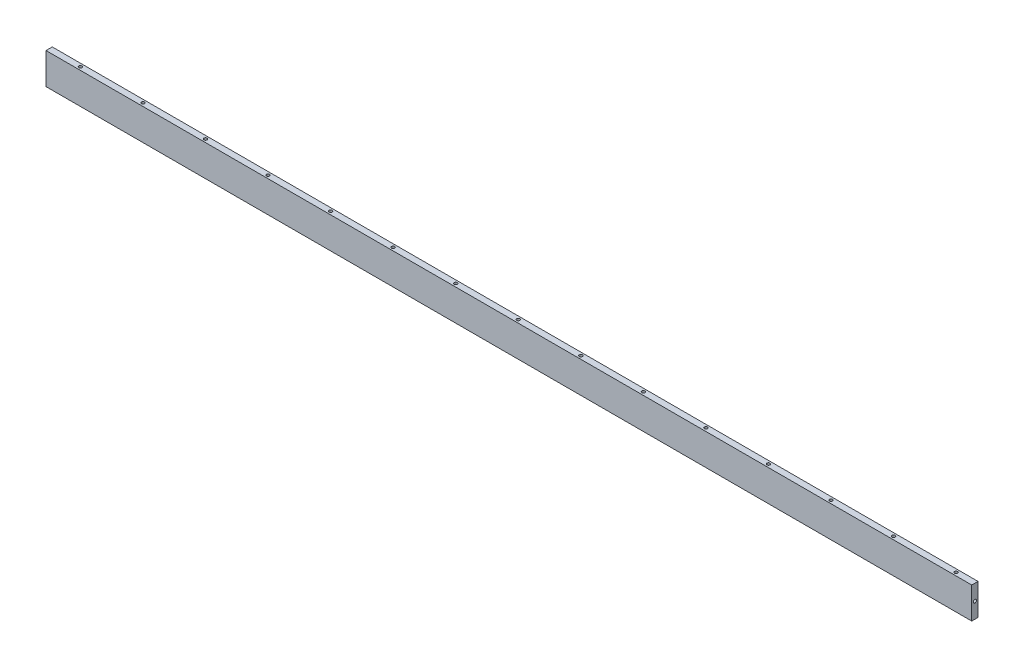
ISO-10303-21;
HEADER;
FILE_DESCRIPTION(('STEP AP214'),'2;1');
FILE_NAME('part.step','',(''),(''),'','','');
FILE_SCHEMA(('AUTOMOTIVE_DESIGN { 1 0 10303 214 1 1 1 1 }'));
ENDSEC;
DATA;
#1=APPLICATION_CONTEXT('core data for automotive mechanical design processes');
#2=APPLICATION_PROTOCOL_DEFINITION('international standard','automotive_design',2000,#1);
#3=PRODUCT_CONTEXT('',#1,'mechanical');
#4=PRODUCT('Part','Part','',(#3));
#5=PRODUCT_RELATED_PRODUCT_CATEGORY('part','',(#4));
#6=PRODUCT_DEFINITION_FORMATION('','',#4);
#7=PRODUCT_DEFINITION_CONTEXT('part definition',#1,'design');
#8=PRODUCT_DEFINITION('design','',#6,#7);
#9=PRODUCT_DEFINITION_SHAPE('','',#8);
#10=(LENGTH_UNIT() NAMED_UNIT(*) SI_UNIT(.MILLI.,.METRE.));
#11=(NAMED_UNIT(*) PLANE_ANGLE_UNIT() SI_UNIT($,.RADIAN.));
#12=(NAMED_UNIT(*) SI_UNIT($,.STERADIAN.) SOLID_ANGLE_UNIT());
#13=UNCERTAINTY_MEASURE_WITH_UNIT(LENGTH_MEASURE(1.E-05),#10,'distance_accuracy_value','');
#14=(GEOMETRIC_REPRESENTATION_CONTEXT(3) GLOBAL_UNCERTAINTY_ASSIGNED_CONTEXT((#13)) GLOBAL_UNIT_ASSIGNED_CONTEXT((#10,
#11,#12)) REPRESENTATION_CONTEXT('',''));
#15=CARTESIAN_POINT('',(0.,0.,0.));
#16=DIRECTION('',(0.,0.,1.));
#17=DIRECTION('',(1.,0.,0.));
#18=AXIS2_PLACEMENT_3D('',#15,#16,#17);
#19=CARTESIAN_POINT('',(-740.,-25.,5.));
#20=DIRECTION('',(1.,0.,0.));
#21=DIRECTION('',(0.,0.,-1.));
#22=AXIS2_PLACEMENT_3D('',#19,#20,#21);
#23=PLANE('',#22);
#24=DIRECTION('',(0.,-1.,0.));
#25=VECTOR('',#24,1.);
#26=CARTESIAN_POINT('',(-740.,-25.,-5.));
#27=LINE('',#26,#25);
#28=CARTESIAN_POINT('',(-740.,25.,-5.));
#29=VERTEX_POINT('',#28);
#30=CARTESIAN_POINT('',(-740.,-25.,-5.));
#31=VERTEX_POINT('',#30);
#32=EDGE_CURVE('E67',#29,#31,#27,.T.);
#33=ORIENTED_EDGE('',*,*,#32,.T.);
#34=DIRECTION('',(0.,0.,-1.));
#35=VECTOR('',#34,1.);
#36=CARTESIAN_POINT('',(-740.,-25.,5.));
#37=LINE('',#36,#35);
#38=CARTESIAN_POINT('',(-740.,-25.,5.));
#39=VERTEX_POINT('',#38);
#40=EDGE_CURVE('E90',#39,#31,#37,.T.);
#41=ORIENTED_EDGE('',*,*,#40,.F.);
#42=DIRECTION('',(0.,-1.,0.));
#43=VECTOR('',#42,1.);
#44=CARTESIAN_POINT('',(-740.,-25.,5.));
#45=LINE('',#44,#43);
#46=CARTESIAN_POINT('',(-740.,25.,5.));
#47=VERTEX_POINT('',#46);
#48=EDGE_CURVE('E83',#47,#39,#45,.T.);
#49=ORIENTED_EDGE('',*,*,#48,.F.);
#50=DIRECTION('',(0.,0.,-1.));
#51=VECTOR('',#50,1.);
#52=CARTESIAN_POINT('',(-740.,25.,5.));
#53=LINE('',#52,#51);
#54=EDGE_CURVE('E42',#47,#29,#53,.T.);
#55=ORIENTED_EDGE('',*,*,#54,.T.);
#56=EDGE_LOOP('',(#33,#41,#49,#55));
#57=FACE_BOUND('',#56,.T.);
#58=CARTESIAN_POINT('',(-740.,0.,0.));
#59=DIRECTION('',(1.,0.,0.));
#60=DIRECTION('',(0.,0.,-1.));
#61=AXIS2_PLACEMENT_3D('',#58,#59,#60);
#62=CIRCLE('',#61,2.5);
#63=CARTESIAN_POINT('',(-740.,0.,-2.5));
#64=VERTEX_POINT('',#63);
#65=EDGE_CURVE('E207',#64,#64,#62,.T.);
#66=ORIENTED_EDGE('',*,*,#65,.T.);
#67=EDGE_LOOP('',(#66));
#68=FACE_BOUND('',#67,.T.);
#69=ADVANCED_FACE('F33',(#57,#68),#23,.F.);
#70=CARTESIAN_POINT('',(740.,-25.,5.));
#71=DIRECTION('',(-1.,0.,0.));
#72=DIRECTION('',(0.,0.,1.));
#73=AXIS2_PLACEMENT_3D('',#70,#71,#72);
#74=PLANE('',#73);
#75=CARTESIAN_POINT('',(740.,0.,0.));
#76=DIRECTION('',(1.,0.,0.));
#77=DIRECTION('',(0.,0.,-1.));
#78=AXIS2_PLACEMENT_3D('',#75,#76,#77);
#79=CIRCLE('',#78,2.5);
#80=CARTESIAN_POINT('',(740.,0.,-2.5));
#81=VERTEX_POINT('',#80);
#82=EDGE_CURVE('E201',#81,#81,#79,.T.);
#83=ORIENTED_EDGE('',*,*,#82,.F.);
#84=EDGE_LOOP('',(#83));
#85=FACE_BOUND('',#84,.T.);
#86=DIRECTION('',(0.,1.,0.));
#87=VECTOR('',#86,1.);
#88=CARTESIAN_POINT('',(740.,-25.,-5.));
#89=LINE('',#88,#87);
#90=CARTESIAN_POINT('',(740.,-25.,-5.));
#91=VERTEX_POINT('',#90);
#92=CARTESIAN_POINT('',(740.,25.,-5.));
#93=VERTEX_POINT('',#92);
#94=EDGE_CURVE('E97',#91,#93,#89,.T.);
#95=ORIENTED_EDGE('',*,*,#94,.T.);
#96=DIRECTION('',(0.,0.,-1.));
#97=VECTOR('',#96,1.);
#98=CARTESIAN_POINT('',(740.,25.,5.));
#99=LINE('',#98,#97);
#100=CARTESIAN_POINT('',(740.,25.,5.));
#101=VERTEX_POINT('',#100);
#102=EDGE_CURVE('E11',#101,#93,#99,.T.);
#103=ORIENTED_EDGE('',*,*,#102,.F.);
#104=DIRECTION('',(0.,1.,0.));
#105=VECTOR('',#104,1.);
#106=CARTESIAN_POINT('',(740.,-25.,5.));
#107=LINE('',#106,#105);
#108=CARTESIAN_POINT('',(740.,-25.,5.));
#109=VERTEX_POINT('',#108);
#110=EDGE_CURVE('E85',#109,#101,#107,.T.);
#111=ORIENTED_EDGE('',*,*,#110,.F.);
#112=DIRECTION('',(0.,0.,-1.));
#113=VECTOR('',#112,1.);
#114=CARTESIAN_POINT('',(740.,-25.,5.));
#115=LINE('',#114,#113);
#116=EDGE_CURVE('E93',#109,#91,#115,.T.);
#117=ORIENTED_EDGE('',*,*,#116,.T.);
#118=EDGE_LOOP('',(#95,#103,#111,#117));
#119=FACE_BOUND('',#118,.T.);
#120=ADVANCED_FACE('F35',(#85,#119),#74,.F.);
#121=CARTESIAN_POINT('',(-740.,25.,5.));
#122=DIRECTION('',(0.,-1.,0.));
#123=DIRECTION('',(0.,0.,-1.));
#124=AXIS2_PLACEMENT_3D('',#121,#122,#123);
#125=PLANE('',#124);
#126=CARTESIAN_POINT('',(710.,25.,0.));
#127=DIRECTION('',(0.,1.,0.));
#128=DIRECTION('',(0.,0.,1.));
#129=AXIS2_PLACEMENT_3D('',#126,#127,#128);
#130=CIRCLE('',#129,2.49999999999991);
#131=CARTESIAN_POINT('',(710.,25.,2.49999999999991));
#132=VERTEX_POINT('',#131);
#133=EDGE_CURVE('E195',#132,#132,#130,.T.);
#134=ORIENTED_EDGE('',*,*,#133,.F.);
#135=EDGE_LOOP('',(#134));
#136=FACE_BOUND('',#135,.T.);
#137=CARTESIAN_POINT('',(610.,25.,0.));
#138=DIRECTION('',(0.,1.,0.));
#139=DIRECTION('',(0.,0.,1.));
#140=AXIS2_PLACEMENT_3D('',#137,#138,#139);
#141=CIRCLE('',#140,2.49999999999991);
#142=CARTESIAN_POINT('',(610.,25.,2.49999999999991));
#143=VERTEX_POINT('',#142);
#144=EDGE_CURVE('E189',#143,#143,#141,.T.);
#145=ORIENTED_EDGE('',*,*,#144,.F.);
#146=EDGE_LOOP('',(#145));
#147=FACE_BOUND('',#146,.T.);
#148=CARTESIAN_POINT('',(510.,25.,0.));
#149=DIRECTION('',(0.,1.,0.));
#150=DIRECTION('',(0.,0.,1.));
#151=AXIS2_PLACEMENT_3D('',#148,#149,#150);
#152=CIRCLE('',#151,2.49999999999991);
#153=CARTESIAN_POINT('',(510.,25.,2.49999999999991));
#154=VERTEX_POINT('',#153);
#155=EDGE_CURVE('E183',#154,#154,#152,.T.);
#156=ORIENTED_EDGE('',*,*,#155,.F.);
#157=EDGE_LOOP('',(#156));
#158=FACE_BOUND('',#157,.T.);
#159=CARTESIAN_POINT('',(410.,25.,0.));
#160=DIRECTION('',(0.,1.,0.));
#161=DIRECTION('',(0.,0.,1.));
#162=AXIS2_PLACEMENT_3D('',#159,#160,#161);
#163=CIRCLE('',#162,2.49999999999991);
#164=CARTESIAN_POINT('',(410.,25.,2.49999999999991));
#165=VERTEX_POINT('',#164);
#166=EDGE_CURVE('E177',#165,#165,#163,.T.);
#167=ORIENTED_EDGE('',*,*,#166,.F.);
#168=EDGE_LOOP('',(#167));
#169=FACE_BOUND('',#168,.T.);
#170=CARTESIAN_POINT('',(310.,25.,0.));
#171=DIRECTION('',(0.,1.,0.));
#172=DIRECTION('',(0.,0.,1.));
#173=AXIS2_PLACEMENT_3D('',#170,#171,#172);
#174=CIRCLE('',#173,2.49999999999991);
#175=CARTESIAN_POINT('',(310.,25.,2.49999999999991));
#176=VERTEX_POINT('',#175);
#177=EDGE_CURVE('E171',#176,#176,#174,.T.);
#178=ORIENTED_EDGE('',*,*,#177,.F.);
#179=EDGE_LOOP('',(#178));
#180=FACE_BOUND('',#179,.T.);
#181=CARTESIAN_POINT('',(210.,25.,0.));
#182=DIRECTION('',(0.,1.,0.));
#183=DIRECTION('',(0.,0.,1.));
#184=AXIS2_PLACEMENT_3D('',#181,#182,#183);
#185=CIRCLE('',#184,2.49999999999991);
#186=CARTESIAN_POINT('',(210.,25.,2.49999999999991));
#187=VERTEX_POINT('',#186);
#188=EDGE_CURVE('E165',#187,#187,#185,.T.);
#189=ORIENTED_EDGE('',*,*,#188,.F.);
#190=EDGE_LOOP('',(#189));
#191=FACE_BOUND('',#190,.T.);
#192=CARTESIAN_POINT('',(110.,25.,0.));
#193=DIRECTION('',(0.,1.,0.));
#194=DIRECTION('',(0.,0.,1.));
#195=AXIS2_PLACEMENT_3D('',#192,#193,#194);
#196=CIRCLE('',#195,2.49999999999991);
#197=CARTESIAN_POINT('',(110.,25.,2.49999999999991));
#198=VERTEX_POINT('',#197);
#199=EDGE_CURVE('E159',#198,#198,#196,.T.);
#200=ORIENTED_EDGE('',*,*,#199,.F.);
#201=EDGE_LOOP('',(#200));
#202=FACE_BOUND('',#201,.T.);
#203=CARTESIAN_POINT('',(10.0000000000001,25.,0.));
#204=DIRECTION('',(0.,1.,0.));
#205=DIRECTION('',(0.,0.,1.));
#206=AXIS2_PLACEMENT_3D('',#203,#204,#205);
#207=CIRCLE('',#206,2.49999999999991);
#208=CARTESIAN_POINT('',(10.0000000000001,25.,2.49999999999991));
#209=VERTEX_POINT('',#208);
#210=EDGE_CURVE('E153',#209,#209,#207,.T.);
#211=ORIENTED_EDGE('',*,*,#210,.F.);
#212=EDGE_LOOP('',(#211));
#213=FACE_BOUND('',#212,.T.);
#214=CARTESIAN_POINT('',(-89.9999999999999,25.,0.));
#215=DIRECTION('',(0.,1.,0.));
#216=DIRECTION('',(0.,0.,1.));
#217=AXIS2_PLACEMENT_3D('',#214,#215,#216);
#218=CIRCLE('',#217,2.49999999999991);
#219=CARTESIAN_POINT('',(-89.9999999999999,25.,2.49999999999991));
#220=VERTEX_POINT('',#219);
#221=EDGE_CURVE('E147',#220,#220,#218,.T.);
#222=ORIENTED_EDGE('',*,*,#221,.F.);
#223=EDGE_LOOP('',(#222));
#224=FACE_BOUND('',#223,.T.);
#225=CARTESIAN_POINT('',(-190.,25.,0.));
#226=DIRECTION('',(0.,1.,0.));
#227=DIRECTION('',(0.,0.,1.));
#228=AXIS2_PLACEMENT_3D('',#225,#226,#227);
#229=CIRCLE('',#228,2.49999999999991);
#230=CARTESIAN_POINT('',(-190.,25.,2.49999999999991));
#231=VERTEX_POINT('',#230);
#232=EDGE_CURVE('E141',#231,#231,#229,.T.);
#233=ORIENTED_EDGE('',*,*,#232,.F.);
#234=EDGE_LOOP('',(#233));
#235=FACE_BOUND('',#234,.T.);
#236=CARTESIAN_POINT('',(-290.,25.,0.));
#237=DIRECTION('',(0.,1.,0.));
#238=DIRECTION('',(0.,0.,1.));
#239=AXIS2_PLACEMENT_3D('',#236,#237,#238);
#240=CIRCLE('',#239,2.49999999999991);
#241=CARTESIAN_POINT('',(-290.,25.,2.49999999999991));
#242=VERTEX_POINT('',#241);
#243=EDGE_CURVE('E135',#242,#242,#240,.T.);
#244=ORIENTED_EDGE('',*,*,#243,.F.);
#245=EDGE_LOOP('',(#244));
#246=FACE_BOUND('',#245,.T.);
#247=CARTESIAN_POINT('',(-390.,25.,0.));
#248=DIRECTION('',(0.,1.,0.));
#249=DIRECTION('',(0.,0.,1.));
#250=AXIS2_PLACEMENT_3D('',#247,#248,#249);
#251=CIRCLE('',#250,2.49999999999991);
#252=CARTESIAN_POINT('',(-390.,25.,2.49999999999991));
#253=VERTEX_POINT('',#252);
#254=EDGE_CURVE('E129',#253,#253,#251,.T.);
#255=ORIENTED_EDGE('',*,*,#254,.F.);
#256=EDGE_LOOP('',(#255));
#257=FACE_BOUND('',#256,.T.);
#258=CARTESIAN_POINT('',(-490.,25.,0.));
#259=DIRECTION('',(0.,1.,0.));
#260=DIRECTION('',(0.,0.,1.));
#261=AXIS2_PLACEMENT_3D('',#258,#259,#260);
#262=CIRCLE('',#261,2.49999999999991);
#263=CARTESIAN_POINT('',(-490.,25.,2.49999999999991));
#264=VERTEX_POINT('',#263);
#265=EDGE_CURVE('E123',#264,#264,#262,.T.);
#266=ORIENTED_EDGE('',*,*,#265,.F.);
#267=EDGE_LOOP('',(#266));
#268=FACE_BOUND('',#267,.T.);
#269=CARTESIAN_POINT('',(-590.,25.,0.));
#270=DIRECTION('',(0.,1.,0.));
#271=DIRECTION('',(0.,0.,1.));
#272=AXIS2_PLACEMENT_3D('',#269,#270,#271);
#273=CIRCLE('',#272,2.49999999999991);
#274=CARTESIAN_POINT('',(-590.,25.,2.49999999999991));
#275=VERTEX_POINT('',#274);
#276=EDGE_CURVE('E117',#275,#275,#273,.T.);
#277=ORIENTED_EDGE('',*,*,#276,.F.);
#278=EDGE_LOOP('',(#277));
#279=FACE_BOUND('',#278,.T.);
#280=CARTESIAN_POINT('',(-690.,25.,0.));
#281=DIRECTION('',(0.,1.,0.));
#282=DIRECTION('',(0.,0.,1.));
#283=AXIS2_PLACEMENT_3D('',#280,#281,#282);
#284=CIRCLE('',#283,2.49999999999991);
#285=CARTESIAN_POINT('',(-690.,25.,2.49999999999991));
#286=VERTEX_POINT('',#285);
#287=EDGE_CURVE('E111',#286,#286,#284,.T.);
#288=ORIENTED_EDGE('',*,*,#287,.F.);
#289=EDGE_LOOP('',(#288));
#290=FACE_BOUND('',#289,.T.);
#291=DIRECTION('',(-1.,0.,0.));
#292=VECTOR('',#291,1.);
#293=CARTESIAN_POINT('',(-740.,25.,-5.));
#294=LINE('',#293,#292);
#295=EDGE_CURVE('E89',#93,#29,#294,.T.);
#296=ORIENTED_EDGE('',*,*,#295,.T.);
#297=ORIENTED_EDGE('',*,*,#54,.F.);
#298=DIRECTION('',(-1.,0.,0.));
#299=VECTOR('',#298,1.);
#300=CARTESIAN_POINT('',(-740.,25.,5.));
#301=LINE('',#300,#299);
#302=EDGE_CURVE('E80',#101,#47,#301,.T.);
#303=ORIENTED_EDGE('',*,*,#302,.F.);
#304=ORIENTED_EDGE('',*,*,#102,.T.);
#305=EDGE_LOOP('',(#296,#297,#303,#304));
#306=FACE_BOUND('',#305,.T.);
#307=ADVANCED_FACE('F88',(#136,#147,#158,#169,#180,#191,#202,#213,#224,#235,#246,#257,#268,#279,
#290,#306),#125,.F.);
#308=CARTESIAN_POINT('',(-740.,-25.,5.));
#309=DIRECTION('',(0.,1.,0.));
#310=DIRECTION('',(0.,0.,1.));
#311=AXIS2_PLACEMENT_3D('',#308,#309,#310);
#312=PLANE('',#311);
#313=DIRECTION('',(1.,0.,0.));
#314=VECTOR('',#313,1.);
#315=CARTESIAN_POINT('',(-740.,-25.,-5.));
#316=LINE('',#315,#314);
#317=EDGE_CURVE('E73',#31,#91,#316,.T.);
#318=ORIENTED_EDGE('',*,*,#317,.T.);
#319=ORIENTED_EDGE('',*,*,#116,.F.);
#320=DIRECTION('',(1.,0.,0.));
#321=VECTOR('',#320,1.);
#322=CARTESIAN_POINT('',(-740.,-25.,5.));
#323=LINE('',#322,#321);
#324=EDGE_CURVE('E50',#39,#109,#323,.T.);
#325=ORIENTED_EDGE('',*,*,#324,.F.);
#326=ORIENTED_EDGE('',*,*,#40,.T.);
#327=EDGE_LOOP('',(#318,#319,#325,#326));
#328=FACE_BOUND('',#327,.T.);
#329=ADVANCED_FACE('F105',(#328),#312,.F.);
#330=CARTESIAN_POINT('',(0.,0.,5.));
#331=DIRECTION('',(0.,0.,-1.));
#332=DIRECTION('',(-1.,0.,0.));
#333=AXIS2_PLACEMENT_3D('',#330,#331,#332);
#334=PLANE('',#333);
#335=ORIENTED_EDGE('',*,*,#110,.T.);
#336=ORIENTED_EDGE('',*,*,#302,.T.);
#337=ORIENTED_EDGE('',*,*,#48,.T.);
#338=ORIENTED_EDGE('',*,*,#324,.T.);
#339=EDGE_LOOP('',(#335,#336,#337,#338));
#340=FACE_BOUND('',#339,.T.);
#341=ADVANCED_FACE('F81',(#340),#334,.F.);
#342=CARTESIAN_POINT('',(0.,0.,-5.));
#343=DIRECTION('',(0.,0.,-1.));
#344=DIRECTION('',(-1.,0.,0.));
#345=AXIS2_PLACEMENT_3D('',#342,#343,#344);
#346=PLANE('',#345);
#347=ORIENTED_EDGE('',*,*,#94,.F.);
#348=ORIENTED_EDGE('',*,*,#317,.F.);
#349=ORIENTED_EDGE('',*,*,#32,.F.);
#350=ORIENTED_EDGE('',*,*,#295,.F.);
#351=EDGE_LOOP('',(#347,#348,#349,#350));
#352=FACE_BOUND('',#351,.T.);
#353=ADVANCED_FACE('F108',(#352),#346,.T.);
#354=CARTESIAN_POINT('',(-690.,20.,0.));
#355=DIRECTION('',(0.,1.,0.));
#356=DIRECTION('',(0.,0.,1.));
#357=AXIS2_PLACEMENT_3D('',#354,#355,#356);
#358=CYLINDRICAL_SURFACE('',#357,2.49999999999991);
#359=CARTESIAN_POINT('',(-690.,20.,0.));
#360=DIRECTION('',(0.,1.,0.));
#361=DIRECTION('',(0.,0.,1.));
#362=AXIS2_PLACEMENT_3D('',#359,#360,#361);
#363=CIRCLE('',#362,2.49999999999991);
#364=CARTESIAN_POINT('',(-690.,20.,2.49999999999991));
#365=VERTEX_POINT('',#364);
#366=EDGE_CURVE('E100',#365,#365,#363,.T.);
#367=ORIENTED_EDGE('',*,*,#366,.F.);
#368=EDGE_LOOP('',(#367));
#369=FACE_BOUND('',#368,.T.);
#370=ORIENTED_EDGE('',*,*,#287,.T.);
#371=EDGE_LOOP('',(#370));
#372=FACE_BOUND('',#371,.T.);
#373=ADVANCED_FACE('F267',(#369,#372),#358,.F.);
#374=CARTESIAN_POINT('',(-690.,20.,0.));
#375=DIRECTION('',(0.,1.,0.));
#376=DIRECTION('',(0.,0.,1.));
#377=AXIS2_PLACEMENT_3D('',#374,#375,#376);
#378=PLANE('',#377);
#379=ORIENTED_EDGE('',*,*,#366,.T.);
#380=EDGE_LOOP('',(#379));
#381=FACE_BOUND('',#380,.T.);
#382=ADVANCED_FACE('F269',(#381),#378,.T.);
#383=CARTESIAN_POINT('',(-590.,20.,0.));
#384=DIRECTION('',(0.,1.,0.));
#385=DIRECTION('',(0.,0.,1.));
#386=AXIS2_PLACEMENT_3D('',#383,#384,#385);
#387=CYLINDRICAL_SURFACE('',#386,2.49999999999991);
#388=CARTESIAN_POINT('',(-590.,20.,0.));
#389=DIRECTION('',(0.,1.,0.));
#390=DIRECTION('',(0.,0.,1.));
#391=AXIS2_PLACEMENT_3D('',#388,#389,#390);
#392=CIRCLE('',#391,2.49999999999991);
#393=CARTESIAN_POINT('',(-590.,20.,2.49999999999991));
#394=VERTEX_POINT('',#393);
#395=EDGE_CURVE('E114',#394,#394,#392,.T.);
#396=ORIENTED_EDGE('',*,*,#395,.F.);
#397=EDGE_LOOP('',(#396));
#398=FACE_BOUND('',#397,.T.);
#399=ORIENTED_EDGE('',*,*,#276,.T.);
#400=EDGE_LOOP('',(#399));
#401=FACE_BOUND('',#400,.T.);
#402=ADVANCED_FACE('F276',(#398,#401),#387,.F.);
#403=CARTESIAN_POINT('',(-590.,20.,0.));
#404=DIRECTION('',(0.,1.,0.));
#405=DIRECTION('',(0.,0.,1.));
#406=AXIS2_PLACEMENT_3D('',#403,#404,#405);
#407=PLANE('',#406);
#408=ORIENTED_EDGE('',*,*,#395,.T.);
#409=EDGE_LOOP('',(#408));
#410=FACE_BOUND('',#409,.T.);
#411=ADVANCED_FACE('F316',(#410),#407,.T.);
#412=CARTESIAN_POINT('',(-490.,20.,0.));
#413=DIRECTION('',(0.,1.,0.));
#414=DIRECTION('',(0.,0.,1.));
#415=AXIS2_PLACEMENT_3D('',#412,#413,#414);
#416=CYLINDRICAL_SURFACE('',#415,2.49999999999991);
#417=CARTESIAN_POINT('',(-490.,20.,0.));
#418=DIRECTION('',(0.,1.,0.));
#419=DIRECTION('',(0.,0.,1.));
#420=AXIS2_PLACEMENT_3D('',#417,#418,#419);
#421=CIRCLE('',#420,2.49999999999991);
#422=CARTESIAN_POINT('',(-490.,20.,2.49999999999991));
#423=VERTEX_POINT('',#422);
#424=EDGE_CURVE('E120',#423,#423,#421,.T.);
#425=ORIENTED_EDGE('',*,*,#424,.F.);
#426=EDGE_LOOP('',(#425));
#427=FACE_BOUND('',#426,.T.);
#428=ORIENTED_EDGE('',*,*,#265,.T.);
#429=EDGE_LOOP('',(#428));
#430=FACE_BOUND('',#429,.T.);
#431=ADVANCED_FACE('F325',(#427,#430),#416,.F.);
#432=CARTESIAN_POINT('',(-490.,20.,0.));
#433=DIRECTION('',(0.,1.,0.));
#434=DIRECTION('',(0.,0.,1.));
#435=AXIS2_PLACEMENT_3D('',#432,#433,#434);
#436=PLANE('',#435);
#437=ORIENTED_EDGE('',*,*,#424,.T.);
#438=EDGE_LOOP('',(#437));
#439=FACE_BOUND('',#438,.T.);
#440=ADVANCED_FACE('F335',(#439),#436,.T.);
#441=CARTESIAN_POINT('',(-390.,20.,0.));
#442=DIRECTION('',(0.,1.,0.));
#443=DIRECTION('',(0.,0.,1.));
#444=AXIS2_PLACEMENT_3D('',#441,#442,#443);
#445=CYLINDRICAL_SURFACE('',#444,2.49999999999991);
#446=CARTESIAN_POINT('',(-390.,20.,0.));
#447=DIRECTION('',(0.,1.,0.));
#448=DIRECTION('',(0.,0.,1.));
#449=AXIS2_PLACEMENT_3D('',#446,#447,#448);
#450=CIRCLE('',#449,2.49999999999991);
#451=CARTESIAN_POINT('',(-390.,20.,2.49999999999991));
#452=VERTEX_POINT('',#451);
#453=EDGE_CURVE('E126',#452,#452,#450,.T.);
#454=ORIENTED_EDGE('',*,*,#453,.F.);
#455=EDGE_LOOP('',(#454));
#456=FACE_BOUND('',#455,.T.);
#457=ORIENTED_EDGE('',*,*,#254,.T.);
#458=EDGE_LOOP('',(#457));
#459=FACE_BOUND('',#458,.T.);
#460=ADVANCED_FACE('F345',(#456,#459),#445,.F.);
#461=CARTESIAN_POINT('',(-390.,20.,0.));
#462=DIRECTION('',(0.,1.,0.));
#463=DIRECTION('',(0.,0.,1.));
#464=AXIS2_PLACEMENT_3D('',#461,#462,#463);
#465=PLANE('',#464);
#466=ORIENTED_EDGE('',*,*,#453,.T.);
#467=EDGE_LOOP('',(#466));
#468=FACE_BOUND('',#467,.T.);
#469=ADVANCED_FACE('F355',(#468),#465,.T.);
#470=CARTESIAN_POINT('',(-290.,20.,0.));
#471=DIRECTION('',(0.,1.,0.));
#472=DIRECTION('',(0.,0.,1.));
#473=AXIS2_PLACEMENT_3D('',#470,#471,#472);
#474=CYLINDRICAL_SURFACE('',#473,2.49999999999991);
#475=CARTESIAN_POINT('',(-290.,20.,0.));
#476=DIRECTION('',(0.,1.,0.));
#477=DIRECTION('',(0.,0.,1.));
#478=AXIS2_PLACEMENT_3D('',#475,#476,#477);
#479=CIRCLE('',#478,2.49999999999991);
#480=CARTESIAN_POINT('',(-290.,20.,2.49999999999991));
#481=VERTEX_POINT('',#480);
#482=EDGE_CURVE('E132',#481,#481,#479,.T.);
#483=ORIENTED_EDGE('',*,*,#482,.F.);
#484=EDGE_LOOP('',(#483));
#485=FACE_BOUND('',#484,.T.);
#486=ORIENTED_EDGE('',*,*,#243,.T.);
#487=EDGE_LOOP('',(#486));
#488=FACE_BOUND('',#487,.T.);
#489=ADVANCED_FACE('F365',(#485,#488),#474,.F.);
#490=CARTESIAN_POINT('',(-290.,20.,0.));
#491=DIRECTION('',(0.,1.,0.));
#492=DIRECTION('',(0.,0.,1.));
#493=AXIS2_PLACEMENT_3D('',#490,#491,#492);
#494=PLANE('',#493);
#495=ORIENTED_EDGE('',*,*,#482,.T.);
#496=EDGE_LOOP('',(#495));
#497=FACE_BOUND('',#496,.T.);
#498=ADVANCED_FACE('F375',(#497),#494,.T.);
#499=CARTESIAN_POINT('',(-190.,20.,0.));
#500=DIRECTION('',(0.,1.,0.));
#501=DIRECTION('',(0.,0.,1.));
#502=AXIS2_PLACEMENT_3D('',#499,#500,#501);
#503=CYLINDRICAL_SURFACE('',#502,2.49999999999991);
#504=CARTESIAN_POINT('',(-190.,20.,0.));
#505=DIRECTION('',(0.,1.,0.));
#506=DIRECTION('',(0.,0.,1.));
#507=AXIS2_PLACEMENT_3D('',#504,#505,#506);
#508=CIRCLE('',#507,2.49999999999991);
#509=CARTESIAN_POINT('',(-190.,20.,2.49999999999991));
#510=VERTEX_POINT('',#509);
#511=EDGE_CURVE('E138',#510,#510,#508,.T.);
#512=ORIENTED_EDGE('',*,*,#511,.F.);
#513=EDGE_LOOP('',(#512));
#514=FACE_BOUND('',#513,.T.);
#515=ORIENTED_EDGE('',*,*,#232,.T.);
#516=EDGE_LOOP('',(#515));
#517=FACE_BOUND('',#516,.T.);
#518=ADVANCED_FACE('F385',(#514,#517),#503,.F.);
#519=CARTESIAN_POINT('',(-190.,20.,0.));
#520=DIRECTION('',(0.,1.,0.));
#521=DIRECTION('',(0.,0.,1.));
#522=AXIS2_PLACEMENT_3D('',#519,#520,#521);
#523=PLANE('',#522);
#524=ORIENTED_EDGE('',*,*,#511,.T.);
#525=EDGE_LOOP('',(#524));
#526=FACE_BOUND('',#525,.T.);
#527=ADVANCED_FACE('F395',(#526),#523,.T.);
#528=CARTESIAN_POINT('',(-89.9999999999999,20.,0.));
#529=DIRECTION('',(0.,1.,0.));
#530=DIRECTION('',(0.,0.,1.));
#531=AXIS2_PLACEMENT_3D('',#528,#529,#530);
#532=CYLINDRICAL_SURFACE('',#531,2.49999999999991);
#533=CARTESIAN_POINT('',(-89.9999999999999,20.,0.));
#534=DIRECTION('',(0.,1.,0.));
#535=DIRECTION('',(0.,0.,1.));
#536=AXIS2_PLACEMENT_3D('',#533,#534,#535);
#537=CIRCLE('',#536,2.49999999999991);
#538=CARTESIAN_POINT('',(-89.9999999999999,20.,2.49999999999991));
#539=VERTEX_POINT('',#538);
#540=EDGE_CURVE('E144',#539,#539,#537,.T.);
#541=ORIENTED_EDGE('',*,*,#540,.F.);
#542=EDGE_LOOP('',(#541));
#543=FACE_BOUND('',#542,.T.);
#544=ORIENTED_EDGE('',*,*,#221,.T.);
#545=EDGE_LOOP('',(#544));
#546=FACE_BOUND('',#545,.T.);
#547=ADVANCED_FACE('F405',(#543,#546),#532,.F.);
#548=CARTESIAN_POINT('',(-89.9999999999999,20.,0.));
#549=DIRECTION('',(0.,1.,0.));
#550=DIRECTION('',(0.,0.,1.));
#551=AXIS2_PLACEMENT_3D('',#548,#549,#550);
#552=PLANE('',#551);
#553=ORIENTED_EDGE('',*,*,#540,.T.);
#554=EDGE_LOOP('',(#553));
#555=FACE_BOUND('',#554,.T.);
#556=ADVANCED_FACE('F415',(#555),#552,.T.);
#557=CARTESIAN_POINT('',(10.0000000000001,20.,0.));
#558=DIRECTION('',(0.,1.,0.));
#559=DIRECTION('',(0.,0.,1.));
#560=AXIS2_PLACEMENT_3D('',#557,#558,#559);
#561=CYLINDRICAL_SURFACE('',#560,2.49999999999991);
#562=CARTESIAN_POINT('',(10.0000000000001,20.,0.));
#563=DIRECTION('',(0.,1.,0.));
#564=DIRECTION('',(0.,0.,1.));
#565=AXIS2_PLACEMENT_3D('',#562,#563,#564);
#566=CIRCLE('',#565,2.49999999999991);
#567=CARTESIAN_POINT('',(10.0000000000001,20.,2.49999999999991));
#568=VERTEX_POINT('',#567);
#569=EDGE_CURVE('E150',#568,#568,#566,.T.);
#570=ORIENTED_EDGE('',*,*,#569,.F.);
#571=EDGE_LOOP('',(#570));
#572=FACE_BOUND('',#571,.T.);
#573=ORIENTED_EDGE('',*,*,#210,.T.);
#574=EDGE_LOOP('',(#573));
#575=FACE_BOUND('',#574,.T.);
#576=ADVANCED_FACE('F425',(#572,#575),#561,.F.);
#577=CARTESIAN_POINT('',(10.0000000000001,20.,0.));
#578=DIRECTION('',(0.,1.,0.));
#579=DIRECTION('',(0.,0.,1.));
#580=AXIS2_PLACEMENT_3D('',#577,#578,#579);
#581=PLANE('',#580);
#582=ORIENTED_EDGE('',*,*,#569,.T.);
#583=EDGE_LOOP('',(#582));
#584=FACE_BOUND('',#583,.T.);
#585=ADVANCED_FACE('F435',(#584),#581,.T.);
#586=CARTESIAN_POINT('',(110.,20.,0.));
#587=DIRECTION('',(0.,1.,0.));
#588=DIRECTION('',(0.,0.,1.));
#589=AXIS2_PLACEMENT_3D('',#586,#587,#588);
#590=CYLINDRICAL_SURFACE('',#589,2.49999999999991);
#591=CARTESIAN_POINT('',(110.,20.,0.));
#592=DIRECTION('',(0.,1.,0.));
#593=DIRECTION('',(0.,0.,1.));
#594=AXIS2_PLACEMENT_3D('',#591,#592,#593);
#595=CIRCLE('',#594,2.49999999999991);
#596=CARTESIAN_POINT('',(110.,20.,2.49999999999991));
#597=VERTEX_POINT('',#596);
#598=EDGE_CURVE('E156',#597,#597,#595,.T.);
#599=ORIENTED_EDGE('',*,*,#598,.F.);
#600=EDGE_LOOP('',(#599));
#601=FACE_BOUND('',#600,.T.);
#602=ORIENTED_EDGE('',*,*,#199,.T.);
#603=EDGE_LOOP('',(#602));
#604=FACE_BOUND('',#603,.T.);
#605=ADVANCED_FACE('F445',(#601,#604),#590,.F.);
#606=CARTESIAN_POINT('',(110.,20.,0.));
#607=DIRECTION('',(0.,1.,0.));
#608=DIRECTION('',(0.,0.,1.));
#609=AXIS2_PLACEMENT_3D('',#606,#607,#608);
#610=PLANE('',#609);
#611=ORIENTED_EDGE('',*,*,#598,.T.);
#612=EDGE_LOOP('',(#611));
#613=FACE_BOUND('',#612,.T.);
#614=ADVANCED_FACE('F455',(#613),#610,.T.);
#615=CARTESIAN_POINT('',(210.,20.,0.));
#616=DIRECTION('',(0.,1.,0.));
#617=DIRECTION('',(0.,0.,1.));
#618=AXIS2_PLACEMENT_3D('',#615,#616,#617);
#619=CYLINDRICAL_SURFACE('',#618,2.49999999999991);
#620=CARTESIAN_POINT('',(210.,20.,0.));
#621=DIRECTION('',(0.,1.,0.));
#622=DIRECTION('',(0.,0.,1.));
#623=AXIS2_PLACEMENT_3D('',#620,#621,#622);
#624=CIRCLE('',#623,2.49999999999991);
#625=CARTESIAN_POINT('',(210.,20.,2.49999999999991));
#626=VERTEX_POINT('',#625);
#627=EDGE_CURVE('E162',#626,#626,#624,.T.);
#628=ORIENTED_EDGE('',*,*,#627,.F.);
#629=EDGE_LOOP('',(#628));
#630=FACE_BOUND('',#629,.T.);
#631=ORIENTED_EDGE('',*,*,#188,.T.);
#632=EDGE_LOOP('',(#631));
#633=FACE_BOUND('',#632,.T.);
#634=ADVANCED_FACE('F465',(#630,#633),#619,.F.);
#635=CARTESIAN_POINT('',(210.,20.,0.));
#636=DIRECTION('',(0.,1.,0.));
#637=DIRECTION('',(0.,0.,1.));
#638=AXIS2_PLACEMENT_3D('',#635,#636,#637);
#639=PLANE('',#638);
#640=ORIENTED_EDGE('',*,*,#627,.T.);
#641=EDGE_LOOP('',(#640));
#642=FACE_BOUND('',#641,.T.);
#643=ADVANCED_FACE('F475',(#642),#639,.T.);
#644=CARTESIAN_POINT('',(310.,20.,0.));
#645=DIRECTION('',(0.,1.,0.));
#646=DIRECTION('',(0.,0.,1.));
#647=AXIS2_PLACEMENT_3D('',#644,#645,#646);
#648=CYLINDRICAL_SURFACE('',#647,2.49999999999991);
#649=CARTESIAN_POINT('',(310.,20.,0.));
#650=DIRECTION('',(0.,1.,0.));
#651=DIRECTION('',(0.,0.,1.));
#652=AXIS2_PLACEMENT_3D('',#649,#650,#651);
#653=CIRCLE('',#652,2.49999999999991);
#654=CARTESIAN_POINT('',(310.,20.,2.49999999999991));
#655=VERTEX_POINT('',#654);
#656=EDGE_CURVE('E168',#655,#655,#653,.T.);
#657=ORIENTED_EDGE('',*,*,#656,.F.);
#658=EDGE_LOOP('',(#657));
#659=FACE_BOUND('',#658,.T.);
#660=ORIENTED_EDGE('',*,*,#177,.T.);
#661=EDGE_LOOP('',(#660));
#662=FACE_BOUND('',#661,.T.);
#663=ADVANCED_FACE('F485',(#659,#662),#648,.F.);
#664=CARTESIAN_POINT('',(310.,20.,0.));
#665=DIRECTION('',(0.,1.,0.));
#666=DIRECTION('',(0.,0.,1.));
#667=AXIS2_PLACEMENT_3D('',#664,#665,#666);
#668=PLANE('',#667);
#669=ORIENTED_EDGE('',*,*,#656,.T.);
#670=EDGE_LOOP('',(#669));
#671=FACE_BOUND('',#670,.T.);
#672=ADVANCED_FACE('F495',(#671),#668,.T.);
#673=CARTESIAN_POINT('',(410.,20.,0.));
#674=DIRECTION('',(0.,1.,0.));
#675=DIRECTION('',(0.,0.,1.));
#676=AXIS2_PLACEMENT_3D('',#673,#674,#675);
#677=CYLINDRICAL_SURFACE('',#676,2.49999999999991);
#678=CARTESIAN_POINT('',(410.,20.,0.));
#679=DIRECTION('',(0.,1.,0.));
#680=DIRECTION('',(0.,0.,1.));
#681=AXIS2_PLACEMENT_3D('',#678,#679,#680);
#682=CIRCLE('',#681,2.49999999999991);
#683=CARTESIAN_POINT('',(410.,20.,2.49999999999991));
#684=VERTEX_POINT('',#683);
#685=EDGE_CURVE('E174',#684,#684,#682,.T.);
#686=ORIENTED_EDGE('',*,*,#685,.F.);
#687=EDGE_LOOP('',(#686));
#688=FACE_BOUND('',#687,.T.);
#689=ORIENTED_EDGE('',*,*,#166,.T.);
#690=EDGE_LOOP('',(#689));
#691=FACE_BOUND('',#690,.T.);
#692=ADVANCED_FACE('F505',(#688,#691),#677,.F.);
#693=CARTESIAN_POINT('',(410.,20.,0.));
#694=DIRECTION('',(0.,1.,0.));
#695=DIRECTION('',(0.,0.,1.));
#696=AXIS2_PLACEMENT_3D('',#693,#694,#695);
#697=PLANE('',#696);
#698=ORIENTED_EDGE('',*,*,#685,.T.);
#699=EDGE_LOOP('',(#698));
#700=FACE_BOUND('',#699,.T.);
#701=ADVANCED_FACE('F515',(#700),#697,.T.);
#702=CARTESIAN_POINT('',(510.,20.,0.));
#703=DIRECTION('',(0.,1.,0.));
#704=DIRECTION('',(0.,0.,1.));
#705=AXIS2_PLACEMENT_3D('',#702,#703,#704);
#706=CYLINDRICAL_SURFACE('',#705,2.49999999999991);
#707=CARTESIAN_POINT('',(510.,20.,0.));
#708=DIRECTION('',(0.,1.,0.));
#709=DIRECTION('',(0.,0.,1.));
#710=AXIS2_PLACEMENT_3D('',#707,#708,#709);
#711=CIRCLE('',#710,2.49999999999991);
#712=CARTESIAN_POINT('',(510.,20.,2.49999999999991));
#713=VERTEX_POINT('',#712);
#714=EDGE_CURVE('E180',#713,#713,#711,.T.);
#715=ORIENTED_EDGE('',*,*,#714,.F.);
#716=EDGE_LOOP('',(#715));
#717=FACE_BOUND('',#716,.T.);
#718=ORIENTED_EDGE('',*,*,#155,.T.);
#719=EDGE_LOOP('',(#718));
#720=FACE_BOUND('',#719,.T.);
#721=ADVANCED_FACE('F525',(#717,#720),#706,.F.);
#722=CARTESIAN_POINT('',(510.,20.,0.));
#723=DIRECTION('',(0.,1.,0.));
#724=DIRECTION('',(0.,0.,1.));
#725=AXIS2_PLACEMENT_3D('',#722,#723,#724);
#726=PLANE('',#725);
#727=ORIENTED_EDGE('',*,*,#714,.T.);
#728=EDGE_LOOP('',(#727));
#729=FACE_BOUND('',#728,.T.);
#730=ADVANCED_FACE('F535',(#729),#726,.T.);
#731=CARTESIAN_POINT('',(610.,20.,0.));
#732=DIRECTION('',(0.,1.,0.));
#733=DIRECTION('',(0.,0.,1.));
#734=AXIS2_PLACEMENT_3D('',#731,#732,#733);
#735=CYLINDRICAL_SURFACE('',#734,2.49999999999991);
#736=CARTESIAN_POINT('',(610.,20.,0.));
#737=DIRECTION('',(0.,1.,0.));
#738=DIRECTION('',(0.,0.,1.));
#739=AXIS2_PLACEMENT_3D('',#736,#737,#738);
#740=CIRCLE('',#739,2.49999999999991);
#741=CARTESIAN_POINT('',(610.,20.,2.49999999999991));
#742=VERTEX_POINT('',#741);
#743=EDGE_CURVE('E186',#742,#742,#740,.T.);
#744=ORIENTED_EDGE('',*,*,#743,.F.);
#745=EDGE_LOOP('',(#744));
#746=FACE_BOUND('',#745,.T.);
#747=ORIENTED_EDGE('',*,*,#144,.T.);
#748=EDGE_LOOP('',(#747));
#749=FACE_BOUND('',#748,.T.);
#750=ADVANCED_FACE('F545',(#746,#749),#735,.F.);
#751=CARTESIAN_POINT('',(610.,20.,0.));
#752=DIRECTION('',(0.,1.,0.));
#753=DIRECTION('',(0.,0.,1.));
#754=AXIS2_PLACEMENT_3D('',#751,#752,#753);
#755=PLANE('',#754);
#756=ORIENTED_EDGE('',*,*,#743,.T.);
#757=EDGE_LOOP('',(#756));
#758=FACE_BOUND('',#757,.T.);
#759=ADVANCED_FACE('F555',(#758),#755,.T.);
#760=CARTESIAN_POINT('',(710.,20.,0.));
#761=DIRECTION('',(0.,1.,0.));
#762=DIRECTION('',(0.,0.,1.));
#763=AXIS2_PLACEMENT_3D('',#760,#761,#762);
#764=CYLINDRICAL_SURFACE('',#763,2.49999999999991);
#765=CARTESIAN_POINT('',(710.,20.,0.));
#766=DIRECTION('',(0.,1.,0.));
#767=DIRECTION('',(0.,0.,1.));
#768=AXIS2_PLACEMENT_3D('',#765,#766,#767);
#769=CIRCLE('',#768,2.49999999999991);
#770=CARTESIAN_POINT('',(710.,20.,2.49999999999991));
#771=VERTEX_POINT('',#770);
#772=EDGE_CURVE('E192',#771,#771,#769,.T.);
#773=ORIENTED_EDGE('',*,*,#772,.F.);
#774=EDGE_LOOP('',(#773));
#775=FACE_BOUND('',#774,.T.);
#776=ORIENTED_EDGE('',*,*,#133,.T.);
#777=EDGE_LOOP('',(#776));
#778=FACE_BOUND('',#777,.T.);
#779=ADVANCED_FACE('F565',(#775,#778),#764,.F.);
#780=CARTESIAN_POINT('',(710.,20.,0.));
#781=DIRECTION('',(0.,1.,0.));
#782=DIRECTION('',(0.,0.,1.));
#783=AXIS2_PLACEMENT_3D('',#780,#781,#782);
#784=PLANE('',#783);
#785=ORIENTED_EDGE('',*,*,#772,.T.);
#786=EDGE_LOOP('',(#785));
#787=FACE_BOUND('',#786,.T.);
#788=ADVANCED_FACE('F575',(#787),#784,.T.);
#789=CARTESIAN_POINT('',(735.,0.,0.));
#790=DIRECTION('',(1.,0.,0.));
#791=DIRECTION('',(0.,0.,-1.));
#792=AXIS2_PLACEMENT_3D('',#789,#790,#791);
#793=CYLINDRICAL_SURFACE('',#792,2.5);
#794=CARTESIAN_POINT('',(735.,0.,0.));
#795=DIRECTION('',(1.,0.,0.));
#796=DIRECTION('',(0.,0.,-1.));
#797=AXIS2_PLACEMENT_3D('',#794,#795,#796);
#798=CIRCLE('',#797,2.5);
#799=CARTESIAN_POINT('',(735.,0.,-2.5));
#800=VERTEX_POINT('',#799);
#801=EDGE_CURVE('E198',#800,#800,#798,.T.);
#802=ORIENTED_EDGE('',*,*,#801,.F.);
#803=EDGE_LOOP('',(#802));
#804=FACE_BOUND('',#803,.T.);
#805=ORIENTED_EDGE('',*,*,#82,.T.);
#806=EDGE_LOOP('',(#805));
#807=FACE_BOUND('',#806,.T.);
#808=ADVANCED_FACE('F585',(#804,#807),#793,.F.);
#809=CARTESIAN_POINT('',(735.,0.,0.));
#810=DIRECTION('',(1.,0.,0.));
#811=DIRECTION('',(0.,0.,-1.));
#812=AXIS2_PLACEMENT_3D('',#809,#810,#811);
#813=PLANE('',#812);
#814=ORIENTED_EDGE('',*,*,#801,.T.);
#815=EDGE_LOOP('',(#814));
#816=FACE_BOUND('',#815,.T.);
#817=ADVANCED_FACE('F222',(#816),#813,.T.);
#818=CARTESIAN_POINT('',(-735.,0.,0.));
#819=DIRECTION('',(-1.,0.,0.));
#820=DIRECTION('',(0.,0.,1.));
#821=AXIS2_PLACEMENT_3D('',#818,#819,#820);
#822=CYLINDRICAL_SURFACE('',#821,2.5);
#823=CARTESIAN_POINT('',(-735.,0.,0.));
#824=DIRECTION('',(1.,0.,0.));
#825=DIRECTION('',(0.,0.,-1.));
#826=AXIS2_PLACEMENT_3D('',#823,#824,#825);
#827=CIRCLE('',#826,2.5);
#828=CARTESIAN_POINT('',(-735.,0.,-2.5));
#829=VERTEX_POINT('',#828);
#830=EDGE_CURVE('E204',#829,#829,#827,.T.);
#831=ORIENTED_EDGE('',*,*,#830,.T.);
#832=EDGE_LOOP('',(#831));
#833=FACE_BOUND('',#832,.T.);
#834=ORIENTED_EDGE('',*,*,#65,.F.);
#835=EDGE_LOOP('',(#834));
#836=FACE_BOUND('',#835,.T.);
#837=ADVANCED_FACE('F213',(#833,#836),#822,.F.);
#838=CARTESIAN_POINT('',(-735.,0.,0.));
#839=DIRECTION('',(-1.,0.,0.));
#840=DIRECTION('',(0.,0.,-1.));
#841=AXIS2_PLACEMENT_3D('',#838,#839,#840);
#842=PLANE('',#841);
#843=ORIENTED_EDGE('',*,*,#830,.F.);
#844=EDGE_LOOP('',(#843));
#845=FACE_BOUND('',#844,.T.);
#846=ADVANCED_FACE('F216',(#845),#842,.T.);
#847=CLOSED_SHELL('',(#69,#120,#307,#329,#341,#353,#373,#382,#402,#411,#431,#440,#460,#469,#489,
#498,#518,#527,#547,#556,#576,#585,#605,#614,#634,#643,#663,#672,#692,#701,#721,#730,#750,#759,
#779,#788,#808,#817,#837,#846));
#848=MANIFOLD_SOLID_BREP('B2',#847);
#849=ADVANCED_BREP_SHAPE_REPRESENTATION('',(#18,#848),#14);
#850=SHAPE_DEFINITION_REPRESENTATION(#9,#849);
ENDSEC;
END-ISO-10303-21;
